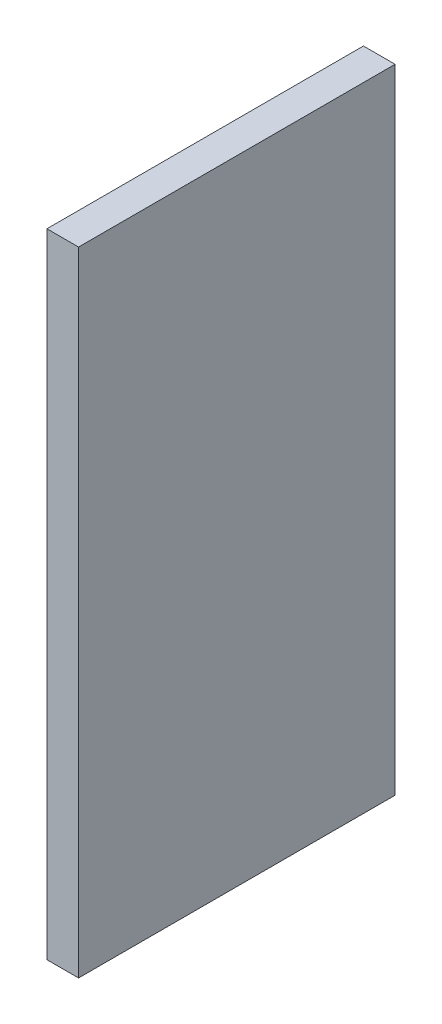
ISO-10303-21;
HEADER;
FILE_DESCRIPTION(('STEP AP214'),'2;1');
FILE_NAME('part.step','',(''),(''),'','','');
FILE_SCHEMA(('AUTOMOTIVE_DESIGN { 1 0 10303 214 1 1 1 1 }'));
ENDSEC;
DATA;
#1=APPLICATION_CONTEXT('core data for automotive mechanical design processes');
#2=APPLICATION_PROTOCOL_DEFINITION('international standard','automotive_design',2000,#1);
#3=PRODUCT_CONTEXT('',#1,'mechanical');
#4=PRODUCT('Part','Part','',(#3));
#5=PRODUCT_RELATED_PRODUCT_CATEGORY('part','',(#4));
#6=PRODUCT_DEFINITION_FORMATION('','',#4);
#7=PRODUCT_DEFINITION_CONTEXT('part definition',#1,'design');
#8=PRODUCT_DEFINITION('design','',#6,#7);
#9=PRODUCT_DEFINITION_SHAPE('','',#8);
#10=(LENGTH_UNIT() NAMED_UNIT(*) SI_UNIT(.MILLI.,.METRE.));
#11=(NAMED_UNIT(*) PLANE_ANGLE_UNIT() SI_UNIT($,.RADIAN.));
#12=(NAMED_UNIT(*) SI_UNIT($,.STERADIAN.) SOLID_ANGLE_UNIT());
#13=UNCERTAINTY_MEASURE_WITH_UNIT(LENGTH_MEASURE(1.E-05),#10,'distance_accuracy_value','');
#14=(GEOMETRIC_REPRESENTATION_CONTEXT(3) GLOBAL_UNCERTAINTY_ASSIGNED_CONTEXT((#13)) GLOBAL_UNIT_ASSIGNED_CONTEXT((#10,
#11,#12)) REPRESENTATION_CONTEXT('',''));
#15=CARTESIAN_POINT('',(0.,0.,0.));
#16=DIRECTION('',(0.,0.,1.));
#17=DIRECTION('',(1.,0.,0.));
#18=AXIS2_PLACEMENT_3D('',#15,#16,#17);
#19=CARTESIAN_POINT('',(4.,-42.4999999999999,-20.));
#20=DIRECTION('',(0.,0.,1.));
#21=DIRECTION('',(0.,-1.,0.));
#22=AXIS2_PLACEMENT_3D('',#19,#20,#21);
#23=PLANE('',#22);
#24=DIRECTION('',(0.,1.,0.));
#25=VECTOR('',#24,1.);
#26=CARTESIAN_POINT('',(0.,-42.4999999999999,-20.));
#27=LINE('',#26,#25);
#28=CARTESIAN_POINT('',(0.,-122.5,-20.));
#29=VERTEX_POINT('',#28);
#30=CARTESIAN_POINT('',(0.,-42.4999999999999,-20.));
#31=VERTEX_POINT('',#30);
#32=EDGE_CURVE('E97',#29,#31,#27,.T.);
#33=ORIENTED_EDGE('',*,*,#32,.T.);
#34=DIRECTION('',(-1.,0.,0.));
#35=VECTOR('',#34,1.);
#36=CARTESIAN_POINT('',(4.,-42.4999999999999,-20.));
#37=LINE('',#36,#35);
#38=CARTESIAN_POINT('',(4.,-42.4999999999999,-20.));
#39=VERTEX_POINT('',#38);
#40=EDGE_CURVE('E11',#39,#31,#37,.T.);
#41=ORIENTED_EDGE('',*,*,#40,.F.);
#42=DIRECTION('',(0.,1.,0.));
#43=VECTOR('',#42,1.);
#44=CARTESIAN_POINT('',(4.,-42.4999999999999,-20.));
#45=LINE('',#44,#43);
#46=CARTESIAN_POINT('',(4.,-122.5,-20.));
#47=VERTEX_POINT('',#46);
#48=EDGE_CURVE('E85',#47,#39,#45,.T.);
#49=ORIENTED_EDGE('',*,*,#48,.F.);
#50=DIRECTION('',(-1.,0.,0.));
#51=VECTOR('',#50,1.);
#52=CARTESIAN_POINT('',(4.,-122.5,-20.));
#53=LINE('',#52,#51);
#54=EDGE_CURVE('E93',#47,#29,#53,.T.);
#55=ORIENTED_EDGE('',*,*,#54,.T.);
#56=EDGE_LOOP('',(#33,#41,#49,#55));
#57=FACE_BOUND('',#56,.T.);
#58=ADVANCED_FACE('F34',(#57),#23,.F.);
#59=CARTESIAN_POINT('',(4.,-42.4999999999999,20.));
#60=DIRECTION('',(0.,-1.,0.));
#61=DIRECTION('',(0.,0.,-1.));
#62=AXIS2_PLACEMENT_3D('',#59,#60,#61);
#63=PLANE('',#62);
#64=DIRECTION('',(0.,0.,1.));
#65=VECTOR('',#64,1.);
#66=CARTESIAN_POINT('',(0.,-42.4999999999999,20.));
#67=LINE('',#66,#65);
#68=CARTESIAN_POINT('',(0.,-42.4999999999999,20.));
#69=VERTEX_POINT('',#68);
#70=EDGE_CURVE('E89',#31,#69,#67,.T.);
#71=ORIENTED_EDGE('',*,*,#70,.T.);
#72=DIRECTION('',(-1.,0.,0.));
#73=VECTOR('',#72,1.);
#74=CARTESIAN_POINT('',(4.,-42.4999999999999,20.));
#75=LINE('',#74,#73);
#76=CARTESIAN_POINT('',(4.,-42.4999999999999,20.));
#77=VERTEX_POINT('',#76);
#78=EDGE_CURVE('E42',#77,#69,#75,.T.);
#79=ORIENTED_EDGE('',*,*,#78,.F.);
#80=DIRECTION('',(0.,0.,1.));
#81=VECTOR('',#80,1.);
#82=CARTESIAN_POINT('',(4.,-42.4999999999999,20.));
#83=LINE('',#82,#81);
#84=EDGE_CURVE('E80',#39,#77,#83,.T.);
#85=ORIENTED_EDGE('',*,*,#84,.F.);
#86=ORIENTED_EDGE('',*,*,#40,.T.);
#87=EDGE_LOOP('',(#71,#79,#85,#86));
#88=FACE_BOUND('',#87,.T.);
#89=ADVANCED_FACE('F88',(#88),#63,.F.);
#90=CARTESIAN_POINT('',(4.,-42.4999999999999,20.));
#91=DIRECTION('',(0.,0.,-1.));
#92=DIRECTION('',(0.,1.,0.));
#93=AXIS2_PLACEMENT_3D('',#90,#91,#92);
#94=PLANE('',#93);
#95=DIRECTION('',(0.,-1.,0.));
#96=VECTOR('',#95,1.);
#97=CARTESIAN_POINT('',(0.,-42.4999999999999,20.));
#98=LINE('',#97,#96);
#99=CARTESIAN_POINT('',(0.,-122.5,20.));
#100=VERTEX_POINT('',#99);
#101=EDGE_CURVE('E67',#69,#100,#98,.T.);
#102=ORIENTED_EDGE('',*,*,#101,.T.);
#103=DIRECTION('',(-1.,0.,0.));
#104=VECTOR('',#103,1.);
#105=CARTESIAN_POINT('',(4.,-122.5,20.));
#106=LINE('',#105,#104);
#107=CARTESIAN_POINT('',(4.,-122.5,20.));
#108=VERTEX_POINT('',#107);
#109=EDGE_CURVE('E90',#108,#100,#106,.T.);
#110=ORIENTED_EDGE('',*,*,#109,.F.);
#111=DIRECTION('',(0.,-1.,0.));
#112=VECTOR('',#111,1.);
#113=CARTESIAN_POINT('',(4.,-42.4999999999999,20.));
#114=LINE('',#113,#112);
#115=EDGE_CURVE('E83',#77,#108,#114,.T.);
#116=ORIENTED_EDGE('',*,*,#115,.F.);
#117=ORIENTED_EDGE('',*,*,#78,.T.);
#118=EDGE_LOOP('',(#102,#110,#116,#117));
#119=FACE_BOUND('',#118,.T.);
#120=ADVANCED_FACE('F91',(#119),#94,.F.);
#121=CARTESIAN_POINT('',(4.,-122.5,20.));
#122=DIRECTION('',(0.,1.,0.));
#123=DIRECTION('',(0.,0.,1.));
#124=AXIS2_PLACEMENT_3D('',#121,#122,#123);
#125=PLANE('',#124);
#126=DIRECTION('',(0.,0.,-1.));
#127=VECTOR('',#126,1.);
#128=CARTESIAN_POINT('',(0.,-122.5,20.));
#129=LINE('',#128,#127);
#130=EDGE_CURVE('E73',#100,#29,#129,.T.);
#131=ORIENTED_EDGE('',*,*,#130,.T.);
#132=ORIENTED_EDGE('',*,*,#54,.F.);
#133=DIRECTION('',(0.,0.,-1.));
#134=VECTOR('',#133,1.);
#135=CARTESIAN_POINT('',(4.,-122.5,20.));
#136=LINE('',#135,#134);
#137=EDGE_CURVE('E50',#108,#47,#136,.T.);
#138=ORIENTED_EDGE('',*,*,#137,.F.);
#139=ORIENTED_EDGE('',*,*,#109,.T.);
#140=EDGE_LOOP('',(#131,#132,#138,#139));
#141=FACE_BOUND('',#140,.T.);
#142=ADVANCED_FACE('F104',(#141),#125,.F.);
#143=CARTESIAN_POINT('',(4.,0.,0.));
#144=DIRECTION('',(1.,0.,0.));
#145=DIRECTION('',(0.,0.,-1.));
#146=AXIS2_PLACEMENT_3D('',#143,#144,#145);
#147=PLANE('',#146);
#148=ORIENTED_EDGE('',*,*,#48,.T.);
#149=ORIENTED_EDGE('',*,*,#84,.T.);
#150=ORIENTED_EDGE('',*,*,#115,.T.);
#151=ORIENTED_EDGE('',*,*,#137,.T.);
#152=EDGE_LOOP('',(#148,#149,#150,#151));
#153=FACE_BOUND('',#152,.T.);
#154=ADVANCED_FACE('F81',(#153),#147,.T.);
#155=CARTESIAN_POINT('',(0.,0.,0.));
#156=DIRECTION('',(1.,0.,0.));
#157=DIRECTION('',(0.,0.,-1.));
#158=AXIS2_PLACEMENT_3D('',#155,#156,#157);
#159=PLANE('',#158);
#160=ORIENTED_EDGE('',*,*,#32,.F.);
#161=ORIENTED_EDGE('',*,*,#130,.F.);
#162=ORIENTED_EDGE('',*,*,#101,.F.);
#163=ORIENTED_EDGE('',*,*,#70,.F.);
#164=EDGE_LOOP('',(#160,#161,#162,#163));
#165=FACE_BOUND('',#164,.T.);
#166=ADVANCED_FACE('F107',(#165),#159,.F.);
#167=CLOSED_SHELL('',(#58,#89,#120,#142,#154,#166));
#168=MANIFOLD_SOLID_BREP('B2',#167);
#169=ADVANCED_BREP_SHAPE_REPRESENTATION('',(#18,#168),#14);
#170=SHAPE_DEFINITION_REPRESENTATION(#9,#169);
ENDSEC;
END-ISO-10303-21;
